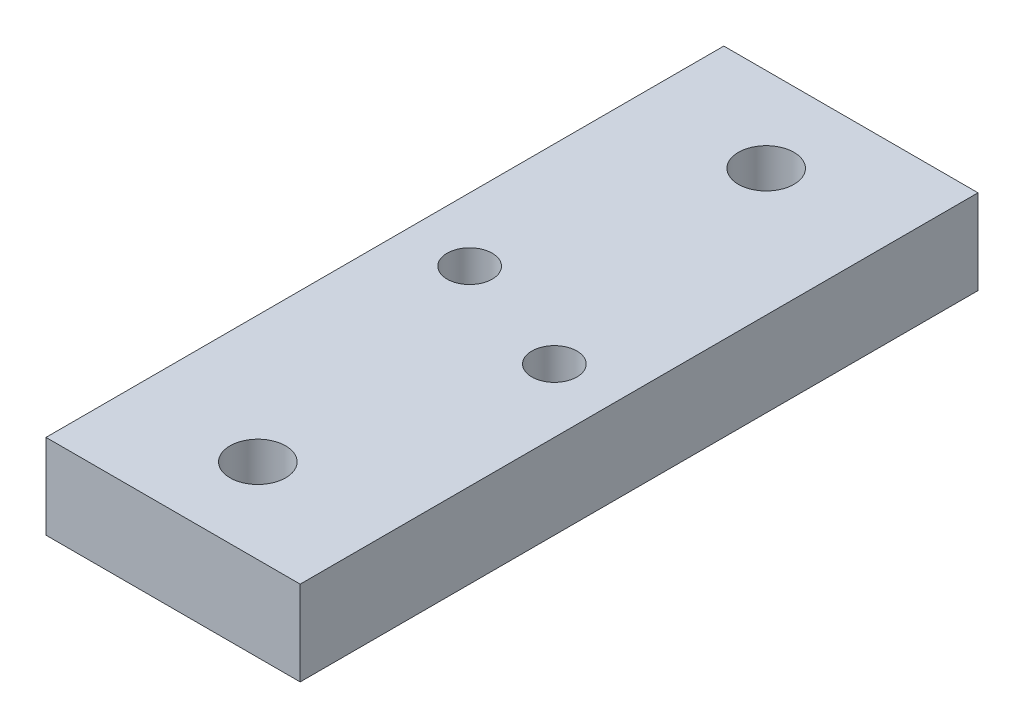
ISO-10303-21;
HEADER;
FILE_DESCRIPTION(('STEP AP214'),'2;1');
FILE_NAME('part.step','',(''),(''),'','','');
FILE_SCHEMA(('AUTOMOTIVE_DESIGN { 1 0 10303 214 1 1 1 1 }'));
ENDSEC;
DATA;
#1=APPLICATION_CONTEXT('core data for automotive mechanical design processes');
#2=APPLICATION_PROTOCOL_DEFINITION('international standard','automotive_design',2000,#1);
#3=PRODUCT_CONTEXT('',#1,'mechanical');
#4=PRODUCT('Part','Part','',(#3));
#5=PRODUCT_RELATED_PRODUCT_CATEGORY('part','',(#4));
#6=PRODUCT_DEFINITION_FORMATION('','',#4);
#7=PRODUCT_DEFINITION_CONTEXT('part definition',#1,'design');
#8=PRODUCT_DEFINITION('design','',#6,#7);
#9=PRODUCT_DEFINITION_SHAPE('','',#8);
#10=(LENGTH_UNIT() NAMED_UNIT(*) SI_UNIT(.MILLI.,.METRE.));
#11=(NAMED_UNIT(*) PLANE_ANGLE_UNIT() SI_UNIT($,.RADIAN.));
#12=(NAMED_UNIT(*) SI_UNIT($,.STERADIAN.) SOLID_ANGLE_UNIT());
#13=UNCERTAINTY_MEASURE_WITH_UNIT(LENGTH_MEASURE(1.E-05),#10,'distance_accuracy_value','');
#14=(GEOMETRIC_REPRESENTATION_CONTEXT(3) GLOBAL_UNCERTAINTY_ASSIGNED_CONTEXT((#13)) GLOBAL_UNIT_ASSIGNED_CONTEXT((#10,
#11,#12)) REPRESENTATION_CONTEXT('',''));
#15=CARTESIAN_POINT('',(0.,0.,0.));
#16=DIRECTION('',(0.,0.,1.));
#17=DIRECTION('',(1.,0.,0.));
#18=AXIS2_PLACEMENT_3D('',#15,#16,#17);
#19=CARTESIAN_POINT('',(0.,12.7,0.));
#20=DIRECTION('',(0.,-1.,0.));
#21=DIRECTION('',(0.,0.,-1.));
#22=AXIS2_PLACEMENT_3D('',#19,#20,#21);
#23=PLANE('',#22);
#24=CARTESIAN_POINT('',(28.575,12.7,-47.625));
#25=DIRECTION('',(0.,-1.,0.));
#26=DIRECTION('',(0.,0.,-1.));
#27=AXIS2_PLACEMENT_3D('',#24,#25,#26);
#28=CIRCLE('',#27,3.3782);
#29=CARTESIAN_POINT('',(28.575,12.7,-51.0032));
#30=VERTEX_POINT('',#29);
#31=EDGE_CURVE('E161',#30,#30,#28,.T.);
#32=ORIENTED_EDGE('',*,*,#31,.T.);
#33=EDGE_LOOP('',(#32));
#34=FACE_BOUND('',#33,.T.);
#35=CARTESIAN_POINT('',(9.525,12.7,-53.975));
#36=DIRECTION('',(0.,-1.,0.));
#37=DIRECTION('',(0.,0.,-1.));
#38=AXIS2_PLACEMENT_3D('',#35,#36,#37);
#39=CIRCLE('',#38,3.3782);
#40=CARTESIAN_POINT('',(9.525,12.7,-57.3532));
#41=VERTEX_POINT('',#40);
#42=EDGE_CURVE('E142',#41,#41,#39,.T.);
#43=ORIENTED_EDGE('',*,*,#42,.T.);
#44=EDGE_LOOP('',(#43));
#45=FACE_BOUND('',#44,.T.);
#46=DIRECTION('',(0.,0.,1.));
#47=VECTOR('',#46,1.);
#48=CARTESIAN_POINT('',(0.,12.7,0.));
#49=LINE('',#48,#47);
#50=CARTESIAN_POINT('',(0.,12.7,-101.6));
#51=VERTEX_POINT('',#50);
#52=CARTESIAN_POINT('',(0.,12.7,0.));
#53=VERTEX_POINT('',#52);
#54=EDGE_CURVE('E92',#51,#53,#49,.T.);
#55=ORIENTED_EDGE('',*,*,#54,.T.);
#56=DIRECTION('',(1.,0.,0.));
#57=VECTOR('',#56,1.);
#58=CARTESIAN_POINT('',(0.,12.7,0.));
#59=LINE('',#58,#57);
#60=CARTESIAN_POINT('',(38.1,12.7,0.));
#61=VERTEX_POINT('',#60);
#62=EDGE_CURVE('E87',#53,#61,#59,.T.);
#63=ORIENTED_EDGE('',*,*,#62,.T.);
#64=DIRECTION('',(0.,0.,-1.));
#65=VECTOR('',#64,1.);
#66=CARTESIAN_POINT('',(38.1,12.7,0.));
#67=LINE('',#66,#65);
#68=CARTESIAN_POINT('',(38.1,12.7,-101.6));
#69=VERTEX_POINT('',#68);
#70=EDGE_CURVE('E90',#61,#69,#67,.T.);
#71=ORIENTED_EDGE('',*,*,#70,.T.);
#72=DIRECTION('',(-1.,0.,0.));
#73=VECTOR('',#72,1.);
#74=CARTESIAN_POINT('',(0.,12.7,-101.6));
#75=LINE('',#74,#73);
#76=EDGE_CURVE('E57',#69,#51,#75,.T.);
#77=ORIENTED_EDGE('',*,*,#76,.T.);
#78=EDGE_LOOP('',(#55,#63,#71,#77));
#79=FACE_BOUND('',#78,.T.);
#80=CARTESIAN_POINT('',(19.05,12.7,-88.9));
#81=DIRECTION('',(0.,1.,0.));
#82=DIRECTION('',(0.,0.,1.));
#83=AXIS2_PLACEMENT_3D('',#80,#81,#82);
#84=CIRCLE('',#83,4.1656);
#85=CARTESIAN_POINT('',(19.05,12.7,-84.7344));
#86=VERTEX_POINT('',#85);
#87=EDGE_CURVE('E112',#86,#86,#84,.T.);
#88=ORIENTED_EDGE('',*,*,#87,.F.);
#89=EDGE_LOOP('',(#88));
#90=FACE_BOUND('',#89,.T.);
#91=CARTESIAN_POINT('',(19.05,12.7,-12.7));
#92=DIRECTION('',(0.,1.,0.));
#93=DIRECTION('',(0.,0.,1.));
#94=AXIS2_PLACEMENT_3D('',#91,#92,#93);
#95=CIRCLE('',#94,4.1656);
#96=CARTESIAN_POINT('',(19.05,12.7,-8.5344));
#97=VERTEX_POINT('',#96);
#98=EDGE_CURVE('E134',#97,#97,#95,.T.);
#99=ORIENTED_EDGE('',*,*,#98,.F.);
#100=EDGE_LOOP('',(#99));
#101=FACE_BOUND('',#100,.T.);
#102=ADVANCED_FACE('F39',(#34,#45,#79,#90,#101),#23,.F.);
#103=CARTESIAN_POINT('',(0.,0.,0.));
#104=DIRECTION('',(0.,-1.,0.));
#105=DIRECTION('',(0.,0.,-1.));
#106=AXIS2_PLACEMENT_3D('',#103,#104,#105);
#107=PLANE('',#106);
#108=CARTESIAN_POINT('',(28.575,0.,-47.625));
#109=DIRECTION('',(0.,-1.,0.));
#110=DIRECTION('',(0.,0.,-1.));
#111=AXIS2_PLACEMENT_3D('',#108,#109,#110);
#112=CIRCLE('',#111,7.9375);
#113=CARTESIAN_POINT('',(28.575,0.,-55.5625));
#114=VERTEX_POINT('',#113);
#115=EDGE_CURVE('E173',#114,#114,#112,.T.);
#116=ORIENTED_EDGE('',*,*,#115,.F.);
#117=EDGE_LOOP('',(#116));
#118=FACE_BOUND('',#117,.T.);
#119=CARTESIAN_POINT('',(9.525,0.,-53.975));
#120=DIRECTION('',(0.,-1.,0.));
#121=DIRECTION('',(0.,0.,-1.));
#122=AXIS2_PLACEMENT_3D('',#119,#120,#121);
#123=CIRCLE('',#122,7.9375);
#124=CARTESIAN_POINT('',(9.525,0.,-61.9125));
#125=VERTEX_POINT('',#124);
#126=EDGE_CURVE('E157',#125,#125,#123,.T.);
#127=ORIENTED_EDGE('',*,*,#126,.F.);
#128=EDGE_LOOP('',(#127));
#129=FACE_BOUND('',#128,.T.);
#130=CARTESIAN_POINT('',(19.05,0.,-88.9));
#131=DIRECTION('',(0.,1.,0.));
#132=DIRECTION('',(0.,0.,1.));
#133=AXIS2_PLACEMENT_3D('',#130,#131,#132);
#134=CIRCLE('',#133,4.1656);
#135=CARTESIAN_POINT('',(19.05,0.,-84.7344));
#136=VERTEX_POINT('',#135);
#137=EDGE_CURVE('E130',#136,#136,#134,.T.);
#138=ORIENTED_EDGE('',*,*,#137,.T.);
#139=EDGE_LOOP('',(#138));
#140=FACE_BOUND('',#139,.T.);
#141=DIRECTION('',(0.,0.,1.));
#142=VECTOR('',#141,1.);
#143=CARTESIAN_POINT('',(0.,0.,0.));
#144=LINE('',#143,#142);
#145=CARTESIAN_POINT('',(0.,0.,-101.6));
#146=VERTEX_POINT('',#145);
#147=CARTESIAN_POINT('',(0.,0.,0.));
#148=VERTEX_POINT('',#147);
#149=EDGE_CURVE('E108',#146,#148,#144,.T.);
#150=ORIENTED_EDGE('',*,*,#149,.F.);
#151=DIRECTION('',(-1.,0.,0.));
#152=VECTOR('',#151,1.);
#153=CARTESIAN_POINT('',(0.,0.,-101.6));
#154=LINE('',#153,#152);
#155=CARTESIAN_POINT('',(38.1,0.,-101.6));
#156=VERTEX_POINT('',#155);
#157=EDGE_CURVE('E80',#156,#146,#154,.T.);
#158=ORIENTED_EDGE('',*,*,#157,.F.);
#159=DIRECTION('',(0.,0.,-1.));
#160=VECTOR('',#159,1.);
#161=CARTESIAN_POINT('',(38.1,0.,0.));
#162=LINE('',#161,#160);
#163=CARTESIAN_POINT('',(38.1,0.,0.));
#164=VERTEX_POINT('',#163);
#165=EDGE_CURVE('E74',#164,#156,#162,.T.);
#166=ORIENTED_EDGE('',*,*,#165,.F.);
#167=DIRECTION('',(1.,0.,0.));
#168=VECTOR('',#167,1.);
#169=CARTESIAN_POINT('',(0.,0.,0.));
#170=LINE('',#169,#168);
#171=EDGE_CURVE('E97',#148,#164,#170,.T.);
#172=ORIENTED_EDGE('',*,*,#171,.F.);
#173=EDGE_LOOP('',(#150,#158,#166,#172));
#174=FACE_BOUND('',#173,.T.);
#175=CARTESIAN_POINT('',(19.05,0.,-12.7));
#176=DIRECTION('',(0.,1.,0.));
#177=DIRECTION('',(0.,0.,1.));
#178=AXIS2_PLACEMENT_3D('',#175,#176,#177);
#179=CIRCLE('',#178,4.1656);
#180=CARTESIAN_POINT('',(19.05,0.,-8.5344));
#181=VERTEX_POINT('',#180);
#182=EDGE_CURVE('E138',#181,#181,#179,.T.);
#183=ORIENTED_EDGE('',*,*,#182,.T.);
#184=EDGE_LOOP('',(#183));
#185=FACE_BOUND('',#184,.T.);
#186=ADVANCED_FACE('F125',(#118,#129,#140,#174,#185),#107,.T.);
#187=CARTESIAN_POINT('',(0.,12.7,0.));
#188=DIRECTION('',(1.,0.,0.));
#189=DIRECTION('',(0.,0.,-1.));
#190=AXIS2_PLACEMENT_3D('',#187,#188,#189);
#191=PLANE('',#190);
#192=ORIENTED_EDGE('',*,*,#149,.T.);
#193=DIRECTION('',(0.,-1.,0.));
#194=VECTOR('',#193,1.);
#195=CARTESIAN_POINT('',(0.,12.7,0.));
#196=LINE('',#195,#194);
#197=EDGE_CURVE('E11',#53,#148,#196,.T.);
#198=ORIENTED_EDGE('',*,*,#197,.F.);
#199=ORIENTED_EDGE('',*,*,#54,.F.);
#200=DIRECTION('',(0.,-1.,0.));
#201=VECTOR('',#200,1.);
#202=CARTESIAN_POINT('',(0.,12.7,-101.6));
#203=LINE('',#202,#201);
#204=EDGE_CURVE('E104',#51,#146,#203,.T.);
#205=ORIENTED_EDGE('',*,*,#204,.T.);
#206=EDGE_LOOP('',(#192,#198,#199,#205));
#207=FACE_BOUND('',#206,.T.);
#208=ADVANCED_FACE('F41',(#207),#191,.F.);
#209=CARTESIAN_POINT('',(0.,12.7,0.));
#210=DIRECTION('',(0.,0.,-1.));
#211=DIRECTION('',(-1.,0.,0.));
#212=AXIS2_PLACEMENT_3D('',#209,#210,#211);
#213=PLANE('',#212);
#214=ORIENTED_EDGE('',*,*,#171,.T.);
#215=DIRECTION('',(0.,-1.,0.));
#216=VECTOR('',#215,1.);
#217=CARTESIAN_POINT('',(38.1,12.7,0.));
#218=LINE('',#217,#216);
#219=EDGE_CURVE('E49',#61,#164,#218,.T.);
#220=ORIENTED_EDGE('',*,*,#219,.F.);
#221=ORIENTED_EDGE('',*,*,#62,.F.);
#222=ORIENTED_EDGE('',*,*,#197,.T.);
#223=EDGE_LOOP('',(#214,#220,#221,#222));
#224=FACE_BOUND('',#223,.T.);
#225=ADVANCED_FACE('F96',(#224),#213,.F.);
#226=CARTESIAN_POINT('',(38.1,12.7,0.));
#227=DIRECTION('',(-1.,0.,0.));
#228=DIRECTION('',(0.,0.,1.));
#229=AXIS2_PLACEMENT_3D('',#226,#227,#228);
#230=PLANE('',#229);
#231=ORIENTED_EDGE('',*,*,#165,.T.);
#232=DIRECTION('',(0.,-1.,0.));
#233=VECTOR('',#232,1.);
#234=CARTESIAN_POINT('',(38.1,12.7,-101.6));
#235=LINE('',#234,#233);
#236=EDGE_CURVE('E99',#69,#156,#235,.T.);
#237=ORIENTED_EDGE('',*,*,#236,.F.);
#238=ORIENTED_EDGE('',*,*,#70,.F.);
#239=ORIENTED_EDGE('',*,*,#219,.T.);
#240=EDGE_LOOP('',(#231,#237,#238,#239));
#241=FACE_BOUND('',#240,.T.);
#242=ADVANCED_FACE('F100',(#241),#230,.F.);
#243=CARTESIAN_POINT('',(0.,12.7,-101.6));
#244=DIRECTION('',(0.,0.,1.));
#245=DIRECTION('',(1.,0.,0.));
#246=AXIS2_PLACEMENT_3D('',#243,#244,#245);
#247=PLANE('',#246);
#248=ORIENTED_EDGE('',*,*,#157,.T.);
#249=ORIENTED_EDGE('',*,*,#204,.F.);
#250=ORIENTED_EDGE('',*,*,#76,.F.);
#251=ORIENTED_EDGE('',*,*,#236,.T.);
#252=EDGE_LOOP('',(#248,#249,#250,#251));
#253=FACE_BOUND('',#252,.T.);
#254=ADVANCED_FACE('F122',(#253),#247,.F.);
#255=CARTESIAN_POINT('',(19.05,12.7,-88.9));
#256=DIRECTION('',(0.,-1.,0.));
#257=DIRECTION('',(0.,0.,-1.));
#258=AXIS2_PLACEMENT_3D('',#255,#256,#257);
#259=CYLINDRICAL_SURFACE('',#258,4.1656);
#260=ORIENTED_EDGE('',*,*,#87,.T.);
#261=EDGE_LOOP('',(#260));
#262=FACE_BOUND('',#261,.T.);
#263=ORIENTED_EDGE('',*,*,#137,.F.);
#264=EDGE_LOOP('',(#263));
#265=FACE_BOUND('',#264,.T.);
#266=ADVANCED_FACE('F187',(#262,#265),#259,.F.);
#267=CARTESIAN_POINT('',(19.05,12.7,-12.7));
#268=DIRECTION('',(0.,-1.,0.));
#269=DIRECTION('',(0.,0.,-1.));
#270=AXIS2_PLACEMENT_3D('',#267,#268,#269);
#271=CYLINDRICAL_SURFACE('',#270,4.1656);
#272=ORIENTED_EDGE('',*,*,#98,.T.);
#273=EDGE_LOOP('',(#272));
#274=FACE_BOUND('',#273,.T.);
#275=ORIENTED_EDGE('',*,*,#182,.F.);
#276=EDGE_LOOP('',(#275));
#277=FACE_BOUND('',#276,.T.);
#278=ADVANCED_FACE('F189',(#274,#277),#271,.F.);
#279=CARTESIAN_POINT('',(9.525,0.,-53.975));
#280=DIRECTION('',(0.,-1.,0.));
#281=DIRECTION('',(0.,0.,-1.));
#282=AXIS2_PLACEMENT_3D('',#279,#280,#281);
#283=CYLINDRICAL_SURFACE('',#282,3.3782);
#284=ORIENTED_EDGE('',*,*,#42,.F.);
#285=EDGE_LOOP('',(#284));
#286=FACE_BOUND('',#285,.T.);
#287=CARTESIAN_POINT('',(9.525,4.826,-53.975));
#288=DIRECTION('',(0.,-1.,0.));
#289=DIRECTION('',(0.,0.,-1.));
#290=AXIS2_PLACEMENT_3D('',#287,#288,#289);
#291=CIRCLE('',#290,3.3782);
#292=CARTESIAN_POINT('',(9.525,4.826,-57.3532));
#293=VERTEX_POINT('',#292);
#294=EDGE_CURVE('E149',#293,#293,#291,.T.);
#295=ORIENTED_EDGE('',*,*,#294,.T.);
#296=EDGE_LOOP('',(#295));
#297=FACE_BOUND('',#296,.T.);
#298=ADVANCED_FACE('F196',(#286,#297),#283,.F.);
#299=CARTESIAN_POINT('',(12.9032,4.826,-53.975));
#300=DIRECTION('',(0.,1.,0.));
#301=DIRECTION('',(0.,0.,1.));
#302=AXIS2_PLACEMENT_3D('',#299,#300,#301);
#303=PLANE('',#302);
#304=ORIENTED_EDGE('',*,*,#294,.F.);
#305=EDGE_LOOP('',(#304));
#306=FACE_BOUND('',#305,.T.);
#307=CARTESIAN_POINT('',(9.525,4.826,-53.975));
#308=DIRECTION('',(0.,-1.,0.));
#309=DIRECTION('',(0.,0.,-1.));
#310=AXIS2_PLACEMENT_3D('',#307,#308,#309);
#311=CIRCLE('',#310,7.9375);
#312=CARTESIAN_POINT('',(9.525,4.826,-61.9125));
#313=VERTEX_POINT('',#312);
#314=EDGE_CURVE('E153',#313,#313,#311,.T.);
#315=ORIENTED_EDGE('',*,*,#314,.T.);
#316=EDGE_LOOP('',(#315));
#317=FACE_BOUND('',#316,.T.);
#318=ADVANCED_FACE('F230',(#306,#317),#303,.F.);
#319=CARTESIAN_POINT('',(9.525,0.,-53.975));
#320=DIRECTION('',(0.,-1.,0.));
#321=DIRECTION('',(0.,0.,-1.));
#322=AXIS2_PLACEMENT_3D('',#319,#320,#321);
#323=CYLINDRICAL_SURFACE('',#322,7.9375);
#324=ORIENTED_EDGE('',*,*,#314,.F.);
#325=EDGE_LOOP('',(#324));
#326=FACE_BOUND('',#325,.T.);
#327=ORIENTED_EDGE('',*,*,#126,.T.);
#328=EDGE_LOOP('',(#327));
#329=FACE_BOUND('',#328,.T.);
#330=ADVANCED_FACE('F241',(#326,#329),#323,.F.);
#331=CARTESIAN_POINT('',(28.575,0.,-47.625));
#332=DIRECTION('',(0.,-1.,0.));
#333=DIRECTION('',(0.,0.,-1.));
#334=AXIS2_PLACEMENT_3D('',#331,#332,#333);
#335=CYLINDRICAL_SURFACE('',#334,3.3782);
#336=ORIENTED_EDGE('',*,*,#31,.F.);
#337=EDGE_LOOP('',(#336));
#338=FACE_BOUND('',#337,.T.);
#339=CARTESIAN_POINT('',(28.575,4.826,-47.625));
#340=DIRECTION('',(0.,-1.,0.));
#341=DIRECTION('',(0.,0.,-1.));
#342=AXIS2_PLACEMENT_3D('',#339,#340,#341);
#343=CIRCLE('',#342,3.3782);
#344=CARTESIAN_POINT('',(28.575,4.826,-51.0032));
#345=VERTEX_POINT('',#344);
#346=EDGE_CURVE('E165',#345,#345,#343,.T.);
#347=ORIENTED_EDGE('',*,*,#346,.T.);
#348=EDGE_LOOP('',(#347));
#349=FACE_BOUND('',#348,.T.);
#350=ADVANCED_FACE('F251',(#338,#349),#335,.F.);
#351=CARTESIAN_POINT('',(31.9532,4.826,-47.625));
#352=DIRECTION('',(0.,1.,0.));
#353=DIRECTION('',(0.,0.,1.));
#354=AXIS2_PLACEMENT_3D('',#351,#352,#353);
#355=PLANE('',#354);
#356=ORIENTED_EDGE('',*,*,#346,.F.);
#357=EDGE_LOOP('',(#356));
#358=FACE_BOUND('',#357,.T.);
#359=CARTESIAN_POINT('',(28.575,4.826,-47.625));
#360=DIRECTION('',(0.,-1.,0.));
#361=DIRECTION('',(0.,0.,-1.));
#362=AXIS2_PLACEMENT_3D('',#359,#360,#361);
#363=CIRCLE('',#362,7.9375);
#364=CARTESIAN_POINT('',(28.575,4.826,-55.5625));
#365=VERTEX_POINT('',#364);
#366=EDGE_CURVE('E169',#365,#365,#363,.T.);
#367=ORIENTED_EDGE('',*,*,#366,.T.);
#368=EDGE_LOOP('',(#367));
#369=FACE_BOUND('',#368,.T.);
#370=ADVANCED_FACE('F261',(#358,#369),#355,.F.);
#371=CARTESIAN_POINT('',(28.575,0.,-47.625));
#372=DIRECTION('',(0.,-1.,0.));
#373=DIRECTION('',(0.,0.,-1.));
#374=AXIS2_PLACEMENT_3D('',#371,#372,#373);
#375=CYLINDRICAL_SURFACE('',#374,7.9375);
#376=ORIENTED_EDGE('',*,*,#366,.F.);
#377=EDGE_LOOP('',(#376));
#378=FACE_BOUND('',#377,.T.);
#379=ORIENTED_EDGE('',*,*,#115,.T.);
#380=EDGE_LOOP('',(#379));
#381=FACE_BOUND('',#380,.T.);
#382=ADVANCED_FACE('F178',(#378,#381),#375,.F.);
#383=CLOSED_SHELL('',(#102,#186,#208,#225,#242,#254,#266,#278,#298,#318,#330,#350,#370,#382));
#384=MANIFOLD_SOLID_BREP('B2',#383);
#385=ADVANCED_BREP_SHAPE_REPRESENTATION('',(#18,#384),#14);
#386=SHAPE_DEFINITION_REPRESENTATION(#9,#385);
ENDSEC;
END-ISO-10303-21;
